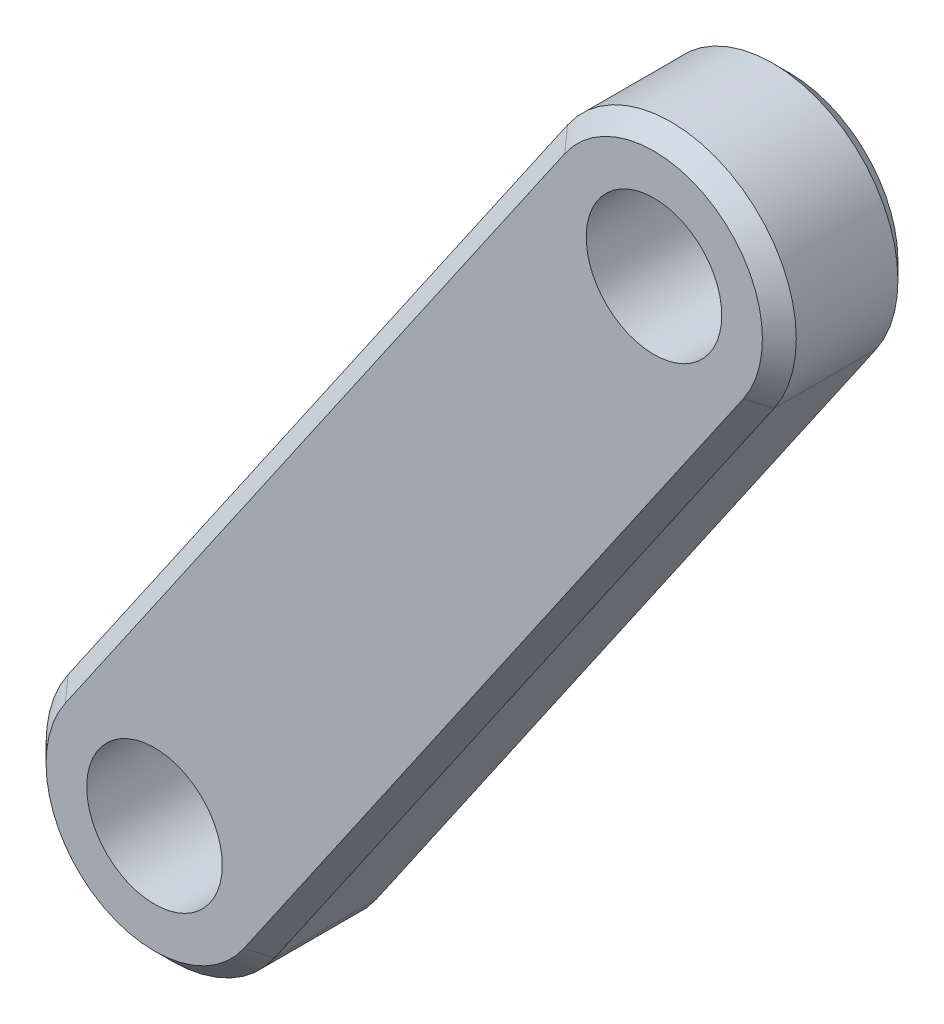
ISO-10303-21;
HEADER;
FILE_DESCRIPTION(('STEP AP214'),'2;1');
FILE_NAME('part.step','',(''),(''),'','','');
FILE_SCHEMA(('AUTOMOTIVE_DESIGN { 1 0 10303 214 1 1 1 1 }'));
ENDSEC;
DATA;
#1=APPLICATION_CONTEXT('core data for automotive mechanical design processes');
#2=APPLICATION_PROTOCOL_DEFINITION('international standard','automotive_design',2000,#1);
#3=PRODUCT_CONTEXT('',#1,'mechanical');
#4=PRODUCT('Part','Part','',(#3));
#5=PRODUCT_RELATED_PRODUCT_CATEGORY('part','',(#4));
#6=PRODUCT_DEFINITION_FORMATION('','',#4);
#7=PRODUCT_DEFINITION_CONTEXT('part definition',#1,'design');
#8=PRODUCT_DEFINITION('design','',#6,#7);
#9=PRODUCT_DEFINITION_SHAPE('','',#8);
#10=(LENGTH_UNIT() NAMED_UNIT(*) SI_UNIT(.MILLI.,.METRE.));
#11=(NAMED_UNIT(*) PLANE_ANGLE_UNIT() SI_UNIT($,.RADIAN.));
#12=(NAMED_UNIT(*) SI_UNIT($,.STERADIAN.) SOLID_ANGLE_UNIT());
#13=UNCERTAINTY_MEASURE_WITH_UNIT(LENGTH_MEASURE(1.E-05),#10,'distance_accuracy_value','');
#14=(GEOMETRIC_REPRESENTATION_CONTEXT(3) GLOBAL_UNCERTAINTY_ASSIGNED_CONTEXT((#13)) GLOBAL_UNIT_ASSIGNED_CONTEXT((#10,
#11,#12)) REPRESENTATION_CONTEXT('',''));
#15=CARTESIAN_POINT('',(0.,0.,0.));
#16=DIRECTION('',(0.,0.,1.));
#17=DIRECTION('',(1.,0.,0.));
#18=AXIS2_PLACEMENT_3D('',#15,#16,#17);
#19=CARTESIAN_POINT('',(6.28016022459788,17.5010601098296,-1.3));
#20=DIRECTION('',(0.,0.,1.));
#21=DIRECTION('',(1.,0.,0.));
#22=AXIS2_PLACEMENT_3D('',#19,#20,#21);
#23=CYLINDRICAL_SURFACE('',#22,3.7);
#24=DIRECTION('',(0.,0.,1.));
#25=VECTOR('',#24,1.);
#26=CARTESIAN_POINT('',(3.23224099203084,19.5987227022758,-1.3));
#27=LINE('',#26,#25);
#28=CARTESIAN_POINT('',(3.23224099203084,19.5987227022758,-0.799999999999996));
#29=VERTEX_POINT('',#28);
#30=CARTESIAN_POINT('',(3.23224099203084,19.5987227022758,2.2));
#31=VERTEX_POINT('',#30);
#32=EDGE_CURVE('E148',#29,#31,#27,.T.);
#33=ORIENTED_EDGE('',*,*,#32,.F.);
#34=CARTESIAN_POINT('',(6.28016022459788,17.5010601098296,-0.799999999999996));
#35=DIRECTION('',(0.,0.,1.));
#36=DIRECTION('',(1.,0.,0.));
#37=AXIS2_PLACEMENT_3D('',#34,#35,#36);
#38=CIRCLE('',#37,3.7);
#39=CARTESIAN_POINT('',(9.32807945716492,15.4033975173835,-0.799999999999999));
#40=VERTEX_POINT('',#39);
#41=EDGE_CURVE('E163',#29,#40,#38,.T.);
#42=ORIENTED_EDGE('',*,*,#41,.T.);
#43=DIRECTION('',(0.,0.,1.));
#44=VECTOR('',#43,1.);
#45=CARTESIAN_POINT('',(9.32807945716492,15.4033975173835,-1.3));
#46=LINE('',#45,#44);
#47=CARTESIAN_POINT('',(9.32807945716492,15.4033975173835,2.2));
#48=VERTEX_POINT('',#47);
#49=EDGE_CURVE('E113',#40,#48,#46,.T.);
#50=ORIENTED_EDGE('',*,*,#49,.T.);
#51=CARTESIAN_POINT('',(6.28016022459788,17.5010601098296,2.2));
#52=DIRECTION('',(0.,0.,1.));
#53=DIRECTION('',(1.,0.,0.));
#54=AXIS2_PLACEMENT_3D('',#51,#52,#53);
#55=CIRCLE('',#54,3.7);
#56=EDGE_CURVE('E161',#48,#31,#55,.F.);
#57=ORIENTED_EDGE('',*,*,#56,.T.);
#58=EDGE_LOOP('',(#33,#42,#50,#57));
#59=FACE_BOUND('',#58,.T.);
#60=ADVANCED_FACE('F40',(#59),#23,.T.);
#61=CARTESIAN_POINT('',(3.23224099203084,19.5987227022758,-1.3));
#62=DIRECTION('',(-0.823761954747849,0.566935835796259,0.));
#63=DIRECTION('',(-0.566935835796259,-0.823761954747849,0.));
#64=AXIS2_PLACEMENT_3D('',#61,#62,#63);
#65=PLANE('',#64);
#66=DIRECTION('',(0.,0.,1.));
#67=VECTOR('',#66,1.);
#68=CARTESIAN_POINT('',(17.9725727227336,41.0165335257199,-1.3));
#69=LINE('',#68,#67);
#70=CARTESIAN_POINT('',(17.9725727227336,41.0165335257199,-0.799999999999996));
#71=VERTEX_POINT('',#70);
#72=CARTESIAN_POINT('',(17.9725727227336,41.0165335257199,2.2));
#73=VERTEX_POINT('',#72);
#74=EDGE_CURVE('E130',#71,#73,#69,.T.);
#75=ORIENTED_EDGE('',*,*,#74,.F.);
#76=DIRECTION('',(-0.566935835796259,-0.823761954747849,0.));
#77=VECTOR('',#76,1.);
#78=CARTESIAN_POINT('',(3.23224099203084,19.5987227022758,-0.799999999999996));
#79=LINE('',#78,#77);
#80=EDGE_CURVE('E159',#71,#29,#79,.T.);
#81=ORIENTED_EDGE('',*,*,#80,.T.);
#82=ORIENTED_EDGE('',*,*,#32,.T.);
#83=DIRECTION('',(0.566935835796259,0.823761954747849,0.));
#84=VECTOR('',#83,1.);
#85=CARTESIAN_POINT('',(3.23224099203084,19.5987227022758,2.2));
#86=LINE('',#85,#84);
#87=EDGE_CURVE('E157',#31,#73,#86,.T.);
#88=ORIENTED_EDGE('',*,*,#87,.T.);
#89=EDGE_LOOP('',(#75,#81,#82,#88));
#90=FACE_BOUND('',#89,.T.);
#91=ADVANCED_FACE('F215',(#90),#65,.T.);
#92=CARTESIAN_POINT('',(21.0204919553006,38.9188709332737,-1.3));
#93=DIRECTION('',(0.,0.,1.));
#94=DIRECTION('',(1.,0.,0.));
#95=AXIS2_PLACEMENT_3D('',#92,#93,#94);
#96=CYLINDRICAL_SURFACE('',#95,3.70000000000001);
#97=DIRECTION('',(0.,0.,1.));
#98=VECTOR('',#97,1.);
#99=CARTESIAN_POINT('',(24.0684111878677,36.8212083408275,-1.3));
#100=LINE('',#99,#98);
#101=CARTESIAN_POINT('',(24.0684111878677,36.8212083408275,-0.799999999999999));
#102=VERTEX_POINT('',#101);
#103=CARTESIAN_POINT('',(24.0684111878677,36.8212083408275,2.20000000000001));
#104=VERTEX_POINT('',#103);
#105=EDGE_CURVE('E111',#102,#104,#100,.T.);
#106=ORIENTED_EDGE('',*,*,#105,.F.);
#107=CARTESIAN_POINT('',(21.0204919553006,38.9188709332737,-0.799999999999996));
#108=DIRECTION('',(0.,0.,1.));
#109=DIRECTION('',(1.,0.,0.));
#110=AXIS2_PLACEMENT_3D('',#107,#108,#109);
#111=CIRCLE('',#110,3.70000000000001);
#112=EDGE_CURVE('E127',#102,#71,#111,.T.);
#113=ORIENTED_EDGE('',*,*,#112,.T.);
#114=ORIENTED_EDGE('',*,*,#74,.T.);
#115=CARTESIAN_POINT('',(21.0204919553006,38.9188709332737,2.2));
#116=DIRECTION('',(0.,0.,1.));
#117=DIRECTION('',(1.,0.,0.));
#118=AXIS2_PLACEMENT_3D('',#115,#116,#117);
#119=CIRCLE('',#118,3.70000000000001);
#120=EDGE_CURVE('E129',#73,#104,#119,.F.);
#121=ORIENTED_EDGE('',*,*,#120,.T.);
#122=EDGE_LOOP('',(#106,#113,#114,#121));
#123=FACE_BOUND('',#122,.T.);
#124=ADVANCED_FACE('F124',(#123),#96,.T.);
#125=CARTESIAN_POINT('',(9.32807945716493,15.4033975173835,-1.3));
#126=DIRECTION('',(0.823761954747849,-0.566935835796259,0.));
#127=DIRECTION('',(0.566935835796259,0.823761954747849,0.));
#128=AXIS2_PLACEMENT_3D('',#125,#126,#127);
#129=PLANE('',#128);
#130=ORIENTED_EDGE('',*,*,#49,.F.);
#131=DIRECTION('',(0.566935835796259,0.823761954747849,0.));
#132=VECTOR('',#131,1.);
#133=CARTESIAN_POINT('',(24.0684111878677,36.8212083408275,-0.799999999999999));
#134=LINE('',#133,#132);
#135=EDGE_CURVE('E108',#40,#102,#134,.T.);
#136=ORIENTED_EDGE('',*,*,#135,.T.);
#137=ORIENTED_EDGE('',*,*,#105,.T.);
#138=DIRECTION('',(-0.566935835796259,-0.823761954747849,0.));
#139=VECTOR('',#138,1.);
#140=CARTESIAN_POINT('',(9.32807945716493,15.4033975173835,2.2));
#141=LINE('',#140,#139);
#142=EDGE_CURVE('E119',#104,#48,#141,.T.);
#143=ORIENTED_EDGE('',*,*,#142,.T.);
#144=EDGE_LOOP('',(#130,#136,#137,#143));
#145=FACE_BOUND('',#144,.T.);
#146=ADVANCED_FACE('F110',(#145),#129,.T.);
#147=CARTESIAN_POINT('',(6.28016022459788,17.5010601098296,-1.3));
#148=DIRECTION('',(0.,0.,1.));
#149=DIRECTION('',(1.,0.,0.));
#150=AXIS2_PLACEMENT_3D('',#147,#148,#149);
#151=PLANE('',#150);
#152=DIRECTION('',(0.566935835796259,0.82376195474785,0.));
#153=VECTOR('',#152,1.);
#154=CARTESIAN_POINT('',(18.3844537001075,40.7330656078218,-1.3));
#155=LINE('',#154,#153);
#156=CARTESIAN_POINT('',(3.64412196940476,19.3152547843777,-1.3));
#157=VERTEX_POINT('',#156);
#158=CARTESIAN_POINT('',(18.3844537001075,40.7330656078218,-1.3));
#159=VERTEX_POINT('',#158);
#160=EDGE_CURVE('E153',#157,#159,#155,.T.);
#161=ORIENTED_EDGE('',*,*,#160,.T.);
#162=CARTESIAN_POINT('',(21.0204919553006,38.9188709332737,-1.3));
#163=DIRECTION('',(0.,0.,1.));
#164=DIRECTION('',(1.,0.,0.));
#165=AXIS2_PLACEMENT_3D('',#162,#163,#164);
#166=CIRCLE('',#165,3.20000000000001);
#167=CARTESIAN_POINT('',(23.6565302104937,37.1046762587257,-1.3));
#168=VERTEX_POINT('',#167);
#169=EDGE_CURVE('E155',#159,#168,#166,.F.);
#170=ORIENTED_EDGE('',*,*,#169,.T.);
#171=DIRECTION('',(-0.566935835796259,-0.823761954747849,0.));
#172=VECTOR('',#171,1.);
#173=CARTESIAN_POINT('',(8.916198479791,15.6868654352816,-1.3));
#174=LINE('',#173,#172);
#175=CARTESIAN_POINT('',(8.916198479791,15.6868654352816,-1.3));
#176=VERTEX_POINT('',#175);
#177=EDGE_CURVE('E135',#168,#176,#174,.T.);
#178=ORIENTED_EDGE('',*,*,#177,.T.);
#179=CARTESIAN_POINT('',(6.28016022459788,17.5010601098296,-1.3));
#180=DIRECTION('',(0.,0.,1.));
#181=DIRECTION('',(1.,0.,0.));
#182=AXIS2_PLACEMENT_3D('',#179,#180,#181);
#183=CIRCLE('',#182,3.2);
#184=EDGE_CURVE('E146',#176,#157,#183,.F.);
#185=ORIENTED_EDGE('',*,*,#184,.T.);
#186=EDGE_LOOP('',(#161,#170,#178,#185));
#187=FACE_BOUND('',#186,.T.);
#188=CARTESIAN_POINT('',(21.0204919553006,38.9188709332737,-1.3));
#189=DIRECTION('',(0.,0.,1.));
#190=DIRECTION('',(1.,0.,0.));
#191=AXIS2_PLACEMENT_3D('',#188,#189,#190);
#192=CIRCLE('',#191,2.);
#193=CARTESIAN_POINT('',(23.0204919553006,38.9188709332737,-1.3));
#194=VERTEX_POINT('',#193);
#195=EDGE_CURVE('E189',#194,#194,#192,.T.);
#196=ORIENTED_EDGE('',*,*,#195,.T.);
#197=EDGE_LOOP('',(#196));
#198=FACE_BOUND('',#197,.T.);
#199=CARTESIAN_POINT('',(6.28016022459788,17.5010601098296,-1.3));
#200=DIRECTION('',(0.,0.,1.));
#201=DIRECTION('',(1.,0.,0.));
#202=AXIS2_PLACEMENT_3D('',#199,#200,#201);
#203=CIRCLE('',#202,2.);
#204=CARTESIAN_POINT('',(8.28016022459788,17.5010601098296,-1.3));
#205=VERTEX_POINT('',#204);
#206=EDGE_CURVE('E184',#205,#205,#203,.T.);
#207=ORIENTED_EDGE('',*,*,#206,.T.);
#208=EDGE_LOOP('',(#207));
#209=FACE_BOUND('',#208,.T.);
#210=ADVANCED_FACE('F201',(#187,#198,#209),#151,.F.);
#211=CARTESIAN_POINT('',(6.28016022459788,17.5010601098296,2.7));
#212=DIRECTION('',(0.,0.,1.));
#213=DIRECTION('',(1.,0.,0.));
#214=AXIS2_PLACEMENT_3D('',#211,#212,#213);
#215=PLANE('',#214);
#216=DIRECTION('',(0.566935835796259,0.823761954747849,0.));
#217=VECTOR('',#216,1.);
#218=CARTESIAN_POINT('',(8.91619847979101,15.6868654352816,2.7));
#219=LINE('',#218,#217);
#220=CARTESIAN_POINT('',(8.916198479791,15.6868654352816,2.7));
#221=VERTEX_POINT('',#220);
#222=CARTESIAN_POINT('',(23.6565302104937,37.1046762587257,2.7));
#223=VERTEX_POINT('',#222);
#224=EDGE_CURVE('E118',#221,#223,#219,.T.);
#225=ORIENTED_EDGE('',*,*,#224,.T.);
#226=CARTESIAN_POINT('',(21.0204919553006,38.9188709332737,2.7));
#227=DIRECTION('',(0.,0.,1.));
#228=DIRECTION('',(1.,0.,0.));
#229=AXIS2_PLACEMENT_3D('',#226,#227,#228);
#230=CIRCLE('',#229,3.20000000000001);
#231=CARTESIAN_POINT('',(18.3844537001075,40.7330656078218,2.7));
#232=VERTEX_POINT('',#231);
#233=EDGE_CURVE('E12',#223,#232,#230,.T.);
#234=ORIENTED_EDGE('',*,*,#233,.T.);
#235=DIRECTION('',(-0.566935835796259,-0.82376195474785,0.));
#236=VECTOR('',#235,1.);
#237=CARTESIAN_POINT('',(3.64412196940476,19.3152547843777,2.7));
#238=LINE('',#237,#236);
#239=CARTESIAN_POINT('',(3.64412196940476,19.3152547843777,2.7));
#240=VERTEX_POINT('',#239);
#241=EDGE_CURVE('E49',#232,#240,#238,.T.);
#242=ORIENTED_EDGE('',*,*,#241,.T.);
#243=CARTESIAN_POINT('',(6.28016022459788,17.5010601098296,2.7));
#244=DIRECTION('',(0.,0.,1.));
#245=DIRECTION('',(1.,0.,0.));
#246=AXIS2_PLACEMENT_3D('',#243,#244,#245);
#247=CIRCLE('',#246,3.2);
#248=EDGE_CURVE('E167',#240,#221,#247,.T.);
#249=ORIENTED_EDGE('',*,*,#248,.T.);
#250=EDGE_LOOP('',(#225,#234,#242,#249));
#251=FACE_BOUND('',#250,.T.);
#252=CARTESIAN_POINT('',(21.0204919553006,38.9188709332737,2.7));
#253=DIRECTION('',(0.,0.,1.));
#254=DIRECTION('',(1.,0.,0.));
#255=AXIS2_PLACEMENT_3D('',#252,#253,#254);
#256=CIRCLE('',#255,2.);
#257=CARTESIAN_POINT('',(23.0204919553006,38.9188709332737,2.7));
#258=VERTEX_POINT('',#257);
#259=EDGE_CURVE('E44',#258,#258,#256,.T.);
#260=ORIENTED_EDGE('',*,*,#259,.F.);
#261=EDGE_LOOP('',(#260));
#262=FACE_BOUND('',#261,.T.);
#263=CARTESIAN_POINT('',(6.28016022459788,17.5010601098296,2.7));
#264=DIRECTION('',(0.,0.,1.));
#265=DIRECTION('',(1.,0.,0.));
#266=AXIS2_PLACEMENT_3D('',#263,#264,#265);
#267=CIRCLE('',#266,2.);
#268=CARTESIAN_POINT('',(8.28016022459788,17.5010601098296,2.7));
#269=VERTEX_POINT('',#268);
#270=EDGE_CURVE('E187',#269,#269,#267,.T.);
#271=ORIENTED_EDGE('',*,*,#270,.F.);
#272=EDGE_LOOP('',(#271));
#273=FACE_BOUND('',#272,.T.);
#274=ADVANCED_FACE('F197',(#251,#262,#273),#215,.T.);
#275=CARTESIAN_POINT('',(6.28016022459788,17.5010601098296,-1.3));
#276=DIRECTION('',(0.,0.,1.));
#277=DIRECTION('',(1.,0.,0.));
#278=AXIS2_PLACEMENT_3D('',#275,#276,#277);
#279=CYLINDRICAL_SURFACE('',#278,2.);
#280=ORIENTED_EDGE('',*,*,#206,.F.);
#281=EDGE_LOOP('',(#280));
#282=FACE_BOUND('',#281,.T.);
#283=ORIENTED_EDGE('',*,*,#270,.T.);
#284=EDGE_LOOP('',(#283));
#285=FACE_BOUND('',#284,.T.);
#286=ADVANCED_FACE('F200',(#282,#285),#279,.F.);
#287=CARTESIAN_POINT('',(21.0204919553006,38.9188709332737,-1.3));
#288=DIRECTION('',(0.,0.,1.));
#289=DIRECTION('',(1.,0.,0.));
#290=AXIS2_PLACEMENT_3D('',#287,#288,#289);
#291=CYLINDRICAL_SURFACE('',#290,2.);
#292=ORIENTED_EDGE('',*,*,#195,.F.);
#293=EDGE_LOOP('',(#292));
#294=FACE_BOUND('',#293,.T.);
#295=ORIENTED_EDGE('',*,*,#259,.T.);
#296=EDGE_LOOP('',(#295));
#297=FACE_BOUND('',#296,.T.);
#298=ADVANCED_FACE('F42',(#294,#297),#291,.F.);
#299=CARTESIAN_POINT('',(6.28016022459788,17.5010601098296,-0.799999999999996));
#300=DIRECTION('',(0.,0.,1.));
#301=DIRECTION('',(1.,0.,0.));
#302=AXIS2_PLACEMENT_3D('',#299,#300,#301);
#303=CONICAL_SURFACE('',#302,3.7,0.785398163397444);
#304=DIRECTION('',(-0.582487664285689,0.400884173989194,0.70710678118655));
#305=VECTOR('',#304,1.);
#306=CARTESIAN_POINT('',(3.64412196940476,19.3152547843777,-1.3));
#307=LINE('',#306,#305);
#308=EDGE_CURVE('E139',#157,#29,#307,.T.);
#309=ORIENTED_EDGE('',*,*,#308,.F.);
#310=ORIENTED_EDGE('',*,*,#184,.F.);
#311=DIRECTION('',(-0.582487664285688,0.400884173989194,-0.707106781186551));
#312=VECTOR('',#311,1.);
#313=CARTESIAN_POINT('',(9.32807945716492,15.4033975173835,-0.799999999999996));
#314=LINE('',#313,#312);
#315=EDGE_CURVE('E174',#40,#176,#314,.T.);
#316=ORIENTED_EDGE('',*,*,#315,.F.);
#317=ORIENTED_EDGE('',*,*,#41,.F.);
#318=EDGE_LOOP('',(#309,#310,#316,#317));
#319=FACE_BOUND('',#318,.T.);
#320=ADVANCED_FACE('F210',(#319),#303,.T.);
#321=CARTESIAN_POINT('',(9.32807945716493,15.4033975173835,-0.799999999999996));
#322=DIRECTION('',(0.582487664285693,-0.4008841739892,-0.707106781186544));
#323=DIRECTION('',(-0.566935835796259,-0.823761954747849,0.));
#324=AXIS2_PLACEMENT_3D('',#321,#322,#323);
#325=PLANE('',#324);
#326=ORIENTED_EDGE('',*,*,#315,.T.);
#327=ORIENTED_EDGE('',*,*,#177,.F.);
#328=DIRECTION('',(-0.58248766428569,0.400884173989196,-0.707106781186549));
#329=VECTOR('',#328,1.);
#330=CARTESIAN_POINT('',(24.0684111878677,36.8212083408275,-0.799999999999999));
#331=LINE('',#330,#329);
#332=EDGE_CURVE('E133',#102,#168,#331,.T.);
#333=ORIENTED_EDGE('',*,*,#332,.F.);
#334=ORIENTED_EDGE('',*,*,#135,.F.);
#335=EDGE_LOOP('',(#326,#327,#333,#334));
#336=FACE_BOUND('',#335,.T.);
#337=ADVANCED_FACE('F134',(#336),#325,.T.);
#338=CARTESIAN_POINT('',(3.23224099203084,19.5987227022758,-0.799999999999996));
#339=DIRECTION('',(-0.582487664285694,0.4008841739892,-0.707106781186543));
#340=DIRECTION('',(0.566935835796259,0.823761954747849,0.));
#341=AXIS2_PLACEMENT_3D('',#338,#339,#340);
#342=PLANE('',#341);
#343=ORIENTED_EDGE('',*,*,#308,.T.);
#344=ORIENTED_EDGE('',*,*,#80,.F.);
#345=DIRECTION('',(-0.582487664285688,0.400884173989194,0.707106781186551));
#346=VECTOR('',#345,1.);
#347=CARTESIAN_POINT('',(18.3844537001075,40.7330656078218,-1.3));
#348=LINE('',#347,#346);
#349=EDGE_CURVE('E140',#159,#71,#348,.T.);
#350=ORIENTED_EDGE('',*,*,#349,.F.);
#351=ORIENTED_EDGE('',*,*,#160,.F.);
#352=EDGE_LOOP('',(#343,#344,#350,#351));
#353=FACE_BOUND('',#352,.T.);
#354=ADVANCED_FACE('F238',(#353),#342,.T.);
#355=CARTESIAN_POINT('',(21.0204919553006,38.9188709332737,-0.799999999999996));
#356=DIRECTION('',(0.,0.,1.));
#357=DIRECTION('',(1.,0.,0.));
#358=AXIS2_PLACEMENT_3D('',#355,#356,#357);
#359=CONICAL_SURFACE('',#358,3.70000000000001,0.785398163397445);
#360=ORIENTED_EDGE('',*,*,#332,.T.);
#361=ORIENTED_EDGE('',*,*,#169,.F.);
#362=ORIENTED_EDGE('',*,*,#349,.T.);
#363=ORIENTED_EDGE('',*,*,#112,.F.);
#364=EDGE_LOOP('',(#360,#361,#362,#363));
#365=FACE_BOUND('',#364,.T.);
#366=ADVANCED_FACE('F142',(#365),#359,.T.);
#367=CARTESIAN_POINT('',(6.28016022459788,17.5010601098296,2.7));
#368=DIRECTION('',(0.,0.,-1.));
#369=DIRECTION('',(-1.,0.,0.));
#370=AXIS2_PLACEMENT_3D('',#367,#368,#369);
#371=CONICAL_SURFACE('',#370,3.2,0.78539816339745);
#372=DIRECTION('',(0.582487664285691,-0.400884173989198,0.707106781186547));
#373=VECTOR('',#372,1.);
#374=CARTESIAN_POINT('',(3.23224099203084,19.5987227022758,2.2));
#375=LINE('',#374,#373);
#376=EDGE_CURVE('E179',#31,#240,#375,.T.);
#377=ORIENTED_EDGE('',*,*,#376,.F.);
#378=ORIENTED_EDGE('',*,*,#56,.F.);
#379=DIRECTION('',(0.582487664285691,-0.400884173989198,-0.707106781186547));
#380=VECTOR('',#379,1.);
#381=CARTESIAN_POINT('',(8.916198479791,15.6868654352816,2.7));
#382=LINE('',#381,#380);
#383=EDGE_CURVE('E170',#221,#48,#382,.T.);
#384=ORIENTED_EDGE('',*,*,#383,.F.);
#385=ORIENTED_EDGE('',*,*,#248,.F.);
#386=EDGE_LOOP('',(#377,#378,#384,#385));
#387=FACE_BOUND('',#386,.T.);
#388=ADVANCED_FACE('F237',(#387),#371,.T.);
#389=CARTESIAN_POINT('',(8.916198479791,15.6868654352816,2.7));
#390=DIRECTION('',(-0.582487664285688,0.400884173989197,-0.70710678118655));
#391=DIRECTION('',(0.566935835796259,0.823761954747849,0.));
#392=AXIS2_PLACEMENT_3D('',#389,#390,#391);
#393=PLANE('',#392);
#394=ORIENTED_EDGE('',*,*,#383,.T.);
#395=ORIENTED_EDGE('',*,*,#142,.F.);
#396=DIRECTION('',(0.582487664285692,-0.400884173989197,-0.707106781186546));
#397=VECTOR('',#396,1.);
#398=CARTESIAN_POINT('',(23.6565302104937,37.1046762587257,2.7));
#399=LINE('',#398,#397);
#400=EDGE_CURVE('E177',#223,#104,#399,.T.);
#401=ORIENTED_EDGE('',*,*,#400,.F.);
#402=ORIENTED_EDGE('',*,*,#224,.F.);
#403=EDGE_LOOP('',(#394,#395,#401,#402));
#404=FACE_BOUND('',#403,.T.);
#405=ADVANCED_FACE('F268',(#404),#393,.F.);
#406=CARTESIAN_POINT('',(3.64412196940476,19.3152547843777,2.7));
#407=DIRECTION('',(0.582487664285691,-0.400884173989198,-0.707106781186547));
#408=DIRECTION('',(-0.566935835796259,-0.823761954747849,0.));
#409=AXIS2_PLACEMENT_3D('',#406,#407,#408);
#410=PLANE('',#409);
#411=ORIENTED_EDGE('',*,*,#376,.T.);
#412=ORIENTED_EDGE('',*,*,#241,.F.);
#413=DIRECTION('',(0.582487664285693,-0.400884173989198,0.707106781186545));
#414=VECTOR('',#413,1.);
#415=CARTESIAN_POINT('',(17.9725727227336,41.0165335257199,2.2));
#416=LINE('',#415,#414);
#417=EDGE_CURVE('E57',#73,#232,#416,.T.);
#418=ORIENTED_EDGE('',*,*,#417,.F.);
#419=ORIENTED_EDGE('',*,*,#87,.F.);
#420=EDGE_LOOP('',(#411,#412,#418,#419));
#421=FACE_BOUND('',#420,.T.);
#422=ADVANCED_FACE('F262',(#421),#410,.F.);
#423=CARTESIAN_POINT('',(21.0204919553006,38.9188709332737,2.7));
#424=DIRECTION('',(0.,0.,-1.));
#425=DIRECTION('',(-1.,0.,0.));
#426=AXIS2_PLACEMENT_3D('',#423,#424,#425);
#427=CONICAL_SURFACE('',#426,3.20000000000001,0.785398163397454);
#428=ORIENTED_EDGE('',*,*,#400,.T.);
#429=ORIENTED_EDGE('',*,*,#120,.F.);
#430=ORIENTED_EDGE('',*,*,#417,.T.);
#431=ORIENTED_EDGE('',*,*,#233,.F.);
#432=EDGE_LOOP('',(#428,#429,#430,#431));
#433=FACE_BOUND('',#432,.T.);
#434=ADVANCED_FACE('F256',(#433),#427,.T.);
#435=CLOSED_SHELL('',(#60,#91,#124,#146,#210,#274,#286,#298,#320,#337,#354,#366,#388,#405,#422,#434));
#436=MANIFOLD_SOLID_BREP('B2',#435);
#437=ADVANCED_BREP_SHAPE_REPRESENTATION('',(#18,#436),#14);
#438=SHAPE_DEFINITION_REPRESENTATION(#9,#437);
ENDSEC;
END-ISO-10303-21;
